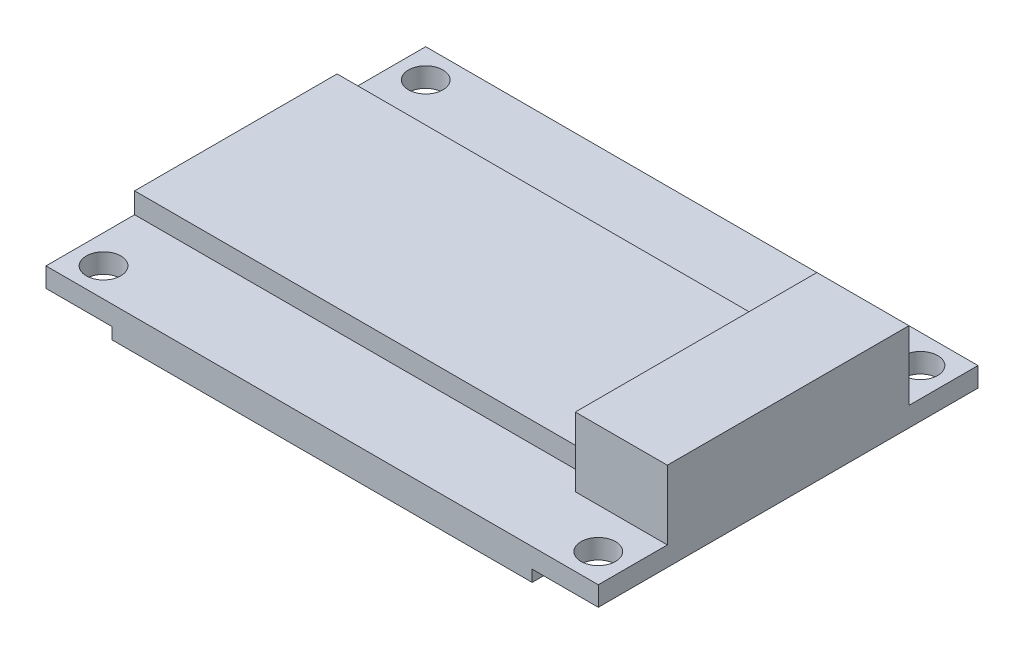
ISO-10303-21;
HEADER;
FILE_DESCRIPTION(('STEP AP214'),'2;1');
FILE_NAME('part.step','',(''),(''),'','','');
FILE_SCHEMA(('AUTOMOTIVE_DESIGN { 1 0 10303 214 1 1 1 1 }'));
ENDSEC;
DATA;
#1=APPLICATION_CONTEXT('core data for automotive mechanical design processes');
#2=APPLICATION_PROTOCOL_DEFINITION('international standard','automotive_design',2000,#1);
#3=PRODUCT_CONTEXT('',#1,'mechanical');
#4=PRODUCT('Part','Part','',(#3));
#5=PRODUCT_RELATED_PRODUCT_CATEGORY('part','',(#4));
#6=PRODUCT_DEFINITION_FORMATION('','',#4);
#7=PRODUCT_DEFINITION_CONTEXT('part definition',#1,'design');
#8=PRODUCT_DEFINITION('design','',#6,#7);
#9=PRODUCT_DEFINITION_SHAPE('','',#8);
#10=(LENGTH_UNIT() NAMED_UNIT(*) SI_UNIT(.MILLI.,.METRE.));
#11=(NAMED_UNIT(*) PLANE_ANGLE_UNIT() SI_UNIT($,.RADIAN.));
#12=(NAMED_UNIT(*) SI_UNIT($,.STERADIAN.) SOLID_ANGLE_UNIT());
#13=UNCERTAINTY_MEASURE_WITH_UNIT(LENGTH_MEASURE(1.E-05),#10,'distance_accuracy_value','');
#14=(GEOMETRIC_REPRESENTATION_CONTEXT(3) GLOBAL_UNCERTAINTY_ASSIGNED_CONTEXT((#13)) GLOBAL_UNIT_ASSIGNED_CONTEXT((#10,
#11,#12)) REPRESENTATION_CONTEXT('',''));
#15=CARTESIAN_POINT('',(0.,0.,0.));
#16=DIRECTION('',(0.,0.,1.));
#17=DIRECTION('',(1.,0.,0.));
#18=AXIS2_PLACEMENT_3D('',#15,#16,#17);
#19=CARTESIAN_POINT('',(0.,1.7,0.));
#20=DIRECTION('',(0.,-1.,0.));
#21=DIRECTION('',(0.,0.,-1.));
#22=AXIS2_PLACEMENT_3D('',#19,#20,#21);
#23=PLANE('',#22);
#24=CARTESIAN_POINT('',(2.5,1.7,-2.5));
#25=DIRECTION('',(0.,1.,0.));
#26=DIRECTION('',(0.,0.,1.));
#27=AXIS2_PLACEMENT_3D('',#24,#25,#26);
#28=CIRCLE('',#27,1.5);
#29=CARTESIAN_POINT('',(2.5,1.7,-0.999999999999999));
#30=VERTEX_POINT('',#29);
#31=EDGE_CURVE('E220',#30,#30,#28,.T.);
#32=ORIENTED_EDGE('',*,*,#31,.F.);
#33=EDGE_LOOP('',(#32));
#34=FACE_BOUND('',#33,.T.);
#35=CARTESIAN_POINT('',(45.5,1.7,-2.5));
#36=DIRECTION('',(0.,1.,0.));
#37=DIRECTION('',(0.,0.,-1.));
#38=AXIS2_PLACEMENT_3D('',#35,#36,#37);
#39=CIRCLE('',#38,1.5);
#40=CARTESIAN_POINT('',(45.5,1.7,-4.));
#41=VERTEX_POINT('',#40);
#42=EDGE_CURVE('E221',#41,#41,#39,.T.);
#43=ORIENTED_EDGE('',*,*,#42,.F.);
#44=EDGE_LOOP('',(#43));
#45=FACE_BOUND('',#44,.T.);
#46=DIRECTION('',(1.,0.,0.));
#47=VECTOR('',#46,1.);
#48=CARTESIAN_POINT('',(40.,1.7,-7.7));
#49=LINE('',#48,#47);
#50=CARTESIAN_POINT('',(0.,1.7,-7.7));
#51=VERTEX_POINT('',#50);
#52=CARTESIAN_POINT('',(40.,1.7,-7.7));
#53=VERTEX_POINT('',#52);
#54=EDGE_CURVE('E358',#51,#53,#49,.T.);
#55=ORIENTED_EDGE('',*,*,#54,.F.);
#56=DIRECTION('',(0.,0.,1.));
#57=VECTOR('',#56,1.);
#58=CARTESIAN_POINT('',(0.,1.7,0.));
#59=LINE('',#58,#57);
#60=CARTESIAN_POINT('',(0.,1.7,0.));
#61=VERTEX_POINT('',#60);
#62=EDGE_CURVE('E180',#51,#61,#59,.T.);
#63=ORIENTED_EDGE('',*,*,#62,.T.);
#64=DIRECTION('',(1.,0.,0.));
#65=VECTOR('',#64,1.);
#66=CARTESIAN_POINT('',(0.,1.7,0.));
#67=LINE('',#66,#65);
#68=CARTESIAN_POINT('',(48.,1.7,0.));
#69=VERTEX_POINT('',#68);
#70=EDGE_CURVE('E278',#61,#69,#67,.T.);
#71=ORIENTED_EDGE('',*,*,#70,.T.);
#72=DIRECTION('',(0.,0.,-1.));
#73=VECTOR('',#72,1.);
#74=CARTESIAN_POINT('',(48.,1.7,0.));
#75=LINE('',#74,#73);
#76=CARTESIAN_POINT('',(48.,1.7,-6.));
#77=VERTEX_POINT('',#76);
#78=EDGE_CURVE('E281',#69,#77,#75,.T.);
#79=ORIENTED_EDGE('',*,*,#78,.T.);
#80=DIRECTION('',(1.,0.,0.));
#81=VECTOR('',#80,1.);
#82=CARTESIAN_POINT('',(40.,1.7,-6.));
#83=LINE('',#82,#81);
#84=CARTESIAN_POINT('',(40.,1.7,-6.));
#85=VERTEX_POINT('',#84);
#86=EDGE_CURVE('E257',#85,#77,#83,.T.);
#87=ORIENTED_EDGE('',*,*,#86,.F.);
#88=DIRECTION('',(0.,0.,1.));
#89=VECTOR('',#88,1.);
#90=CARTESIAN_POINT('',(40.,1.7,-27.));
#91=LINE('',#90,#89);
#92=EDGE_CURVE('E240',#53,#85,#91,.T.);
#93=ORIENTED_EDGE('',*,*,#92,.F.);
#94=EDGE_LOOP('',(#55,#63,#71,#79,#87,#93));
#95=FACE_BOUND('',#94,.T.);
#96=ADVANCED_FACE('F40',(#34,#45,#95),#23,.F.);
#97=CARTESIAN_POINT('',(45.5,1.7,-30.5));
#98=DIRECTION('',(0.,1.,0.));
#99=DIRECTION('',(0.,0.,1.));
#100=AXIS2_PLACEMENT_3D('',#97,#98,#99);
#101=CIRCLE('',#100,1.5);
#102=CARTESIAN_POINT('',(45.5,1.7,-29.));
#103=VERTEX_POINT('',#102);
#104=EDGE_CURVE('E227',#103,#103,#101,.T.);
#105=ORIENTED_EDGE('',*,*,#104,.F.);
#106=EDGE_LOOP('',(#105));
#107=FACE_BOUND('',#106,.T.);
#108=CARTESIAN_POINT('',(2.5,1.7,-30.5));
#109=DIRECTION('',(0.,1.,0.));
#110=DIRECTION('',(0.,0.,-1.));
#111=AXIS2_PLACEMENT_3D('',#108,#109,#110);
#112=CIRCLE('',#111,1.5);
#113=CARTESIAN_POINT('',(2.5,1.7,-32.));
#114=VERTEX_POINT('',#113);
#115=EDGE_CURVE('E216',#114,#114,#112,.T.);
#116=ORIENTED_EDGE('',*,*,#115,.F.);
#117=EDGE_LOOP('',(#116));
#118=FACE_BOUND('',#117,.T.);
#119=DIRECTION('',(-1.,0.,0.));
#120=VECTOR('',#119,1.);
#121=CARTESIAN_POINT('',(40.,1.7,-25.3));
#122=LINE('',#121,#120);
#123=CARTESIAN_POINT('',(40.,1.7,-25.3));
#124=VERTEX_POINT('',#123);
#125=CARTESIAN_POINT('',(0.,1.7,-25.3));
#126=VERTEX_POINT('',#125);
#127=EDGE_CURVE('E175',#124,#126,#122,.T.);
#128=ORIENTED_EDGE('',*,*,#127,.F.);
#129=CARTESIAN_POINT('',(40.,1.7,-27.));
#130=VERTEX_POINT('',#129);
#131=EDGE_CURVE('E254',#130,#124,#91,.T.);
#132=ORIENTED_EDGE('',*,*,#131,.F.);
#133=DIRECTION('',(-1.,0.,0.));
#134=VECTOR('',#133,1.);
#135=CARTESIAN_POINT('',(40.,1.7,-27.));
#136=LINE('',#135,#134);
#137=CARTESIAN_POINT('',(48.,1.7,-27.));
#138=VERTEX_POINT('',#137);
#139=EDGE_CURVE('E247',#138,#130,#136,.T.);
#140=ORIENTED_EDGE('',*,*,#139,.F.);
#141=CARTESIAN_POINT('',(48.,1.7,-33.));
#142=VERTEX_POINT('',#141);
#143=EDGE_CURVE('E280',#138,#142,#75,.T.);
#144=ORIENTED_EDGE('',*,*,#143,.T.);
#145=DIRECTION('',(-1.,0.,0.));
#146=VECTOR('',#145,1.);
#147=CARTESIAN_POINT('',(0.,1.7,-33.));
#148=LINE('',#147,#146);
#149=CARTESIAN_POINT('',(0.,1.7,-33.));
#150=VERTEX_POINT('',#149);
#151=EDGE_CURVE('E283',#142,#150,#148,.T.);
#152=ORIENTED_EDGE('',*,*,#151,.T.);
#153=EDGE_CURVE('E274',#150,#126,#59,.T.);
#154=ORIENTED_EDGE('',*,*,#153,.T.);
#155=EDGE_LOOP('',(#128,#132,#140,#144,#152,#154));
#156=FACE_BOUND('',#155,.T.);
#157=ADVANCED_FACE('F340',(#107,#118,#156),#23,.F.);
#158=CARTESIAN_POINT('',(40.,7.7,-27.));
#159=DIRECTION('',(1.,0.,0.));
#160=DIRECTION('',(0.,0.,-1.));
#161=AXIS2_PLACEMENT_3D('',#158,#159,#160);
#162=PLANE('',#161);
#163=DIRECTION('',(0.,-1.,0.));
#164=VECTOR('',#163,1.);
#165=CARTESIAN_POINT('',(40.,3.5,-7.7));
#166=LINE('',#165,#164);
#167=CARTESIAN_POINT('',(40.,3.5,-7.70000000000001));
#168=VERTEX_POINT('',#167);
#169=EDGE_CURVE('E55',#168,#53,#166,.T.);
#170=ORIENTED_EDGE('',*,*,#169,.T.);
#171=ORIENTED_EDGE('',*,*,#92,.T.);
#172=DIRECTION('',(0.,-1.,0.));
#173=VECTOR('',#172,1.);
#174=CARTESIAN_POINT('',(40.,7.7,-6.));
#175=LINE('',#174,#173);
#176=CARTESIAN_POINT('',(40.,7.7,-6.));
#177=VERTEX_POINT('',#176);
#178=EDGE_CURVE('E270',#177,#85,#175,.T.);
#179=ORIENTED_EDGE('',*,*,#178,.F.);
#180=DIRECTION('',(0.,0.,1.));
#181=VECTOR('',#180,1.);
#182=CARTESIAN_POINT('',(40.,7.7,-27.));
#183=LINE('',#182,#181);
#184=CARTESIAN_POINT('',(40.,7.7,-27.));
#185=VERTEX_POINT('',#184);
#186=EDGE_CURVE('E243',#185,#177,#183,.T.);
#187=ORIENTED_EDGE('',*,*,#186,.F.);
#188=DIRECTION('',(0.,-1.,0.));
#189=VECTOR('',#188,1.);
#190=CARTESIAN_POINT('',(40.,7.7,-27.));
#191=LINE('',#190,#189);
#192=EDGE_CURVE('E253',#185,#130,#191,.T.);
#193=ORIENTED_EDGE('',*,*,#192,.T.);
#194=ORIENTED_EDGE('',*,*,#131,.T.);
#195=DIRECTION('',(0.,-1.,0.));
#196=VECTOR('',#195,1.);
#197=CARTESIAN_POINT('',(40.,3.5,-25.3));
#198=LINE('',#197,#196);
#199=CARTESIAN_POINT('',(40.,3.5,-25.3));
#200=VERTEX_POINT('',#199);
#201=EDGE_CURVE('E186',#200,#124,#198,.T.);
#202=ORIENTED_EDGE('',*,*,#201,.F.);
#203=DIRECTION('',(0.,0.,-1.));
#204=VECTOR('',#203,1.);
#205=CARTESIAN_POINT('',(40.,3.5,-7.7));
#206=LINE('',#205,#204);
#207=EDGE_CURVE('E164',#168,#200,#206,.T.);
#208=ORIENTED_EDGE('',*,*,#207,.F.);
#209=EDGE_LOOP('',(#170,#171,#179,#187,#193,#194,#202,#208));
#210=FACE_BOUND('',#209,.T.);
#211=ADVANCED_FACE('F371',(#210),#162,.F.);
#212=CARTESIAN_POINT('',(0.,0.,0.));
#213=DIRECTION('',(0.,-1.,0.));
#214=DIRECTION('',(0.,0.,-1.));
#215=AXIS2_PLACEMENT_3D('',#212,#213,#214);
#216=PLANE('',#215);
#217=DIRECTION('',(0.,0.,1.));
#218=VECTOR('',#217,1.);
#219=CARTESIAN_POINT('',(42.25,0.,-33.));
#220=LINE('',#219,#218);
#221=CARTESIAN_POINT('',(42.25,0.,-33.));
#222=VERTEX_POINT('',#221);
#223=CARTESIAN_POINT('',(42.25,0.,0.));
#224=VERTEX_POINT('',#223);
#225=EDGE_CURVE('E181',#222,#224,#220,.T.);
#226=ORIENTED_EDGE('',*,*,#225,.F.);
#227=DIRECTION('',(-1.,0.,0.));
#228=VECTOR('',#227,1.);
#229=CARTESIAN_POINT('',(0.,0.,-33.));
#230=LINE('',#229,#228);
#231=CARTESIAN_POINT('',(48.,0.,-33.));
#232=VERTEX_POINT('',#231);
#233=EDGE_CURVE('E296',#232,#222,#230,.T.);
#234=ORIENTED_EDGE('',*,*,#233,.F.);
#235=DIRECTION('',(0.,0.,-1.));
#236=VECTOR('',#235,1.);
#237=CARTESIAN_POINT('',(48.,0.,0.));
#238=LINE('',#237,#236);
#239=CARTESIAN_POINT('',(48.,0.,0.));
#240=VERTEX_POINT('',#239);
#241=EDGE_CURVE('E292',#240,#232,#238,.T.);
#242=ORIENTED_EDGE('',*,*,#241,.F.);
#243=DIRECTION('',(1.,0.,0.));
#244=VECTOR('',#243,1.);
#245=CARTESIAN_POINT('',(0.,0.,0.));
#246=LINE('',#245,#244);
#247=EDGE_CURVE('E63',#224,#240,#246,.T.);
#248=ORIENTED_EDGE('',*,*,#247,.F.);
#249=EDGE_LOOP('',(#226,#234,#242,#248));
#250=FACE_BOUND('',#249,.T.);
#251=CARTESIAN_POINT('',(45.5,0.,-2.5));
#252=DIRECTION('',(0.,1.,0.));
#253=DIRECTION('',(0.,0.,-1.));
#254=AXIS2_PLACEMENT_3D('',#251,#252,#253);
#255=CIRCLE('',#254,1.5);
#256=CARTESIAN_POINT('',(45.5,0.,-4.));
#257=VERTEX_POINT('',#256);
#258=EDGE_CURVE('E217',#257,#257,#255,.T.);
#259=ORIENTED_EDGE('',*,*,#258,.T.);
#260=EDGE_LOOP('',(#259));
#261=FACE_BOUND('',#260,.T.);
#262=CARTESIAN_POINT('',(45.5,0.,-30.5));
#263=DIRECTION('',(0.,1.,0.));
#264=DIRECTION('',(0.,0.,1.));
#265=AXIS2_PLACEMENT_3D('',#262,#263,#264);
#266=CIRCLE('',#265,1.5);
#267=CARTESIAN_POINT('',(45.5,0.,-29.));
#268=VERTEX_POINT('',#267);
#269=EDGE_CURVE('E224',#268,#268,#266,.T.);
#270=ORIENTED_EDGE('',*,*,#269,.T.);
#271=EDGE_LOOP('',(#270));
#272=FACE_BOUND('',#271,.T.);
#273=ADVANCED_FACE('F313',(#250,#261,#272),#216,.T.);
#274=CARTESIAN_POINT('',(0.,1.7,0.));
#275=DIRECTION('',(1.,0.,0.));
#276=DIRECTION('',(0.,0.,-1.));
#277=AXIS2_PLACEMENT_3D('',#274,#275,#276);
#278=PLANE('',#277);
#279=DIRECTION('',(0.,0.,1.));
#280=VECTOR('',#279,1.);
#281=CARTESIAN_POINT('',(0.,0.,0.));
#282=LINE('',#281,#280);
#283=CARTESIAN_POINT('',(0.,0.,-33.));
#284=VERTEX_POINT('',#283);
#285=CARTESIAN_POINT('',(0.,0.,0.));
#286=VERTEX_POINT('',#285);
#287=EDGE_CURVE('E273',#284,#286,#282,.T.);
#288=ORIENTED_EDGE('',*,*,#287,.T.);
#289=DIRECTION('',(0.,-1.,0.));
#290=VECTOR('',#289,1.);
#291=CARTESIAN_POINT('',(0.,1.7,0.));
#292=LINE('',#291,#290);
#293=EDGE_CURVE('E11',#61,#286,#292,.T.);
#294=ORIENTED_EDGE('',*,*,#293,.F.);
#295=ORIENTED_EDGE('',*,*,#62,.F.);
#296=DIRECTION('',(0.,-1.,0.));
#297=VECTOR('',#296,1.);
#298=CARTESIAN_POINT('',(0.,3.5,-7.7));
#299=LINE('',#298,#297);
#300=CARTESIAN_POINT('',(0.,3.5,-7.7));
#301=VERTEX_POINT('',#300);
#302=EDGE_CURVE('E160',#301,#51,#299,.T.);
#303=ORIENTED_EDGE('',*,*,#302,.F.);
#304=DIRECTION('',(0.,0.,1.));
#305=VECTOR('',#304,1.);
#306=CARTESIAN_POINT('',(0.,3.5,-7.7));
#307=LINE('',#306,#305);
#308=CARTESIAN_POINT('',(0.,3.5,-25.3));
#309=VERTEX_POINT('',#308);
#310=EDGE_CURVE('E165',#309,#301,#307,.T.);
#311=ORIENTED_EDGE('',*,*,#310,.F.);
#312=DIRECTION('',(0.,-1.,0.));
#313=VECTOR('',#312,1.);
#314=CARTESIAN_POINT('',(0.,3.5,-25.3));
#315=LINE('',#314,#313);
#316=EDGE_CURVE('E365',#309,#126,#315,.T.);
#317=ORIENTED_EDGE('',*,*,#316,.T.);
#318=ORIENTED_EDGE('',*,*,#153,.F.);
#319=DIRECTION('',(0.,-1.,0.));
#320=VECTOR('',#319,1.);
#321=CARTESIAN_POINT('',(0.,1.7,-33.));
#322=LINE('',#321,#320);
#323=EDGE_CURVE('E286',#150,#284,#322,.T.);
#324=ORIENTED_EDGE('',*,*,#323,.T.);
#325=EDGE_LOOP('',(#288,#294,#295,#303,#311,#317,#318,#324));
#326=FACE_BOUND('',#325,.T.);
#327=ADVANCED_FACE('F42',(#326),#278,.F.);
#328=CARTESIAN_POINT('',(0.,1.7,0.));
#329=DIRECTION('',(0.,0.,-1.));
#330=DIRECTION('',(-1.,0.,0.));
#331=AXIS2_PLACEMENT_3D('',#328,#329,#330);
#332=PLANE('',#331);
#333=CARTESIAN_POINT('',(5.75,0.,0.));
#334=VERTEX_POINT('',#333);
#335=EDGE_CURVE('E289',#286,#334,#246,.T.);
#336=ORIENTED_EDGE('',*,*,#335,.T.);
#337=DIRECTION('',(0.,1.,0.));
#338=VECTOR('',#337,1.);
#339=CARTESIAN_POINT('',(5.75,-1.,0.));
#340=LINE('',#339,#338);
#341=CARTESIAN_POINT('',(5.75,-1.,0.));
#342=VERTEX_POINT('',#341);
#343=EDGE_CURVE('E211',#342,#334,#340,.T.);
#344=ORIENTED_EDGE('',*,*,#343,.F.);
#345=DIRECTION('',(-1.,0.,0.));
#346=VECTOR('',#345,1.);
#347=CARTESIAN_POINT('',(5.75,-1.,0.));
#348=LINE('',#347,#346);
#349=CARTESIAN_POINT('',(42.25,-1.,0.));
#350=VERTEX_POINT('',#349);
#351=EDGE_CURVE('E193',#350,#342,#348,.T.);
#352=ORIENTED_EDGE('',*,*,#351,.F.);
#353=DIRECTION('',(0.,1.,0.));
#354=VECTOR('',#353,1.);
#355=CARTESIAN_POINT('',(42.25,-1.,0.));
#356=LINE('',#355,#354);
#357=EDGE_CURVE('E214',#350,#224,#356,.T.);
#358=ORIENTED_EDGE('',*,*,#357,.T.);
#359=ORIENTED_EDGE('',*,*,#247,.T.);
#360=DIRECTION('',(0.,-1.,0.));
#361=VECTOR('',#360,1.);
#362=CARTESIAN_POINT('',(48.,1.7,0.));
#363=LINE('',#362,#361);
#364=EDGE_CURVE('E48',#69,#240,#363,.T.);
#365=ORIENTED_EDGE('',*,*,#364,.F.);
#366=ORIENTED_EDGE('',*,*,#70,.F.);
#367=ORIENTED_EDGE('',*,*,#293,.T.);
#368=EDGE_LOOP('',(#336,#344,#352,#358,#359,#365,#366,#367));
#369=FACE_BOUND('',#368,.T.);
#370=ADVANCED_FACE('F336',(#369),#332,.F.);
#371=CARTESIAN_POINT('',(48.,1.7,0.));
#372=DIRECTION('',(-1.,0.,0.));
#373=DIRECTION('',(0.,0.,1.));
#374=AXIS2_PLACEMENT_3D('',#371,#372,#373);
#375=PLANE('',#374);
#376=ORIENTED_EDGE('',*,*,#241,.T.);
#377=DIRECTION('',(0.,-1.,0.));
#378=VECTOR('',#377,1.);
#379=CARTESIAN_POINT('',(48.,1.7,-33.));
#380=LINE('',#379,#378);
#381=EDGE_CURVE('E302',#142,#232,#380,.T.);
#382=ORIENTED_EDGE('',*,*,#381,.F.);
#383=ORIENTED_EDGE('',*,*,#143,.F.);
#384=DIRECTION('',(0.,-1.,0.));
#385=VECTOR('',#384,1.);
#386=CARTESIAN_POINT('',(48.,7.7,-27.));
#387=LINE('',#386,#385);
#388=CARTESIAN_POINT('',(48.,7.7,-27.));
#389=VERTEX_POINT('',#388);
#390=EDGE_CURVE('E264',#389,#138,#387,.T.);
#391=ORIENTED_EDGE('',*,*,#390,.F.);
#392=DIRECTION('',(0.,0.,-1.));
#393=VECTOR('',#392,1.);
#394=CARTESIAN_POINT('',(48.,7.7,-27.));
#395=LINE('',#394,#393);
#396=CARTESIAN_POINT('',(48.,7.7,-6.));
#397=VERTEX_POINT('',#396);
#398=EDGE_CURVE('E249',#397,#389,#395,.T.);
#399=ORIENTED_EDGE('',*,*,#398,.F.);
#400=DIRECTION('',(0.,-1.,0.));
#401=VECTOR('',#400,1.);
#402=CARTESIAN_POINT('',(48.,7.7,-6.));
#403=LINE('',#402,#401);
#404=EDGE_CURVE('E267',#397,#77,#403,.T.);
#405=ORIENTED_EDGE('',*,*,#404,.T.);
#406=ORIENTED_EDGE('',*,*,#78,.F.);
#407=ORIENTED_EDGE('',*,*,#364,.T.);
#408=EDGE_LOOP('',(#376,#382,#383,#391,#399,#405,#406,#407));
#409=FACE_BOUND('',#408,.T.);
#410=ADVANCED_FACE('F308',(#409),#375,.F.);
#411=CARTESIAN_POINT('',(0.,1.7,-33.));
#412=DIRECTION('',(0.,0.,1.));
#413=DIRECTION('',(1.,0.,0.));
#414=AXIS2_PLACEMENT_3D('',#411,#412,#413);
#415=PLANE('',#414);
#416=ORIENTED_EDGE('',*,*,#233,.T.);
#417=DIRECTION('',(0.,1.,0.));
#418=VECTOR('',#417,1.);
#419=CARTESIAN_POINT('',(42.25,-1.,-33.));
#420=LINE('',#419,#418);
#421=CARTESIAN_POINT('',(42.25,-1.,-33.));
#422=VERTEX_POINT('',#421);
#423=EDGE_CURVE('E200',#422,#222,#420,.T.);
#424=ORIENTED_EDGE('',*,*,#423,.F.);
#425=DIRECTION('',(1.,0.,0.));
#426=VECTOR('',#425,1.);
#427=CARTESIAN_POINT('',(5.75,-1.,-33.));
#428=LINE('',#427,#426);
#429=CARTESIAN_POINT('',(5.75,-1.,-33.));
#430=VERTEX_POINT('',#429);
#431=EDGE_CURVE('E198',#430,#422,#428,.T.);
#432=ORIENTED_EDGE('',*,*,#431,.F.);
#433=DIRECTION('',(0.,1.,0.));
#434=VECTOR('',#433,1.);
#435=CARTESIAN_POINT('',(5.75,-1.,-33.));
#436=LINE('',#435,#434);
#437=CARTESIAN_POINT('',(5.75,0.,-33.));
#438=VERTEX_POINT('',#437);
#439=EDGE_CURVE('E207',#430,#438,#436,.T.);
#440=ORIENTED_EDGE('',*,*,#439,.T.);
#441=EDGE_CURVE('E295',#438,#284,#230,.T.);
#442=ORIENTED_EDGE('',*,*,#441,.T.);
#443=ORIENTED_EDGE('',*,*,#323,.F.);
#444=ORIENTED_EDGE('',*,*,#151,.F.);
#445=ORIENTED_EDGE('',*,*,#381,.T.);
#446=EDGE_LOOP('',(#416,#424,#432,#440,#442,#443,#444,#445));
#447=FACE_BOUND('',#446,.T.);
#448=ADVANCED_FACE('F317',(#447),#415,.F.);
#449=DIRECTION('',(0.,0.,-1.));
#450=VECTOR('',#449,1.);
#451=CARTESIAN_POINT('',(5.75,0.,-33.));
#452=LINE('',#451,#450);
#453=EDGE_CURVE('E184',#334,#438,#452,.T.);
#454=ORIENTED_EDGE('',*,*,#453,.F.);
#455=ORIENTED_EDGE('',*,*,#335,.F.);
#456=ORIENTED_EDGE('',*,*,#287,.F.);
#457=ORIENTED_EDGE('',*,*,#441,.F.);
#458=EDGE_LOOP('',(#454,#455,#456,#457));
#459=FACE_BOUND('',#458,.T.);
#460=CARTESIAN_POINT('',(2.5,0.,-30.5));
#461=DIRECTION('',(0.,1.,0.));
#462=DIRECTION('',(0.,0.,-1.));
#463=AXIS2_PLACEMENT_3D('',#460,#461,#462);
#464=CIRCLE('',#463,1.5);
#465=CARTESIAN_POINT('',(2.5,0.,-32.));
#466=VERTEX_POINT('',#465);
#467=EDGE_CURVE('E230',#466,#466,#464,.T.);
#468=ORIENTED_EDGE('',*,*,#467,.T.);
#469=EDGE_LOOP('',(#468));
#470=FACE_BOUND('',#469,.T.);
#471=CARTESIAN_POINT('',(2.5,0.,-2.5));
#472=DIRECTION('',(0.,1.,0.));
#473=DIRECTION('',(0.,0.,1.));
#474=AXIS2_PLACEMENT_3D('',#471,#472,#473);
#475=CIRCLE('',#474,1.5);
#476=CARTESIAN_POINT('',(2.5,0.,-0.999999999999999));
#477=VERTEX_POINT('',#476);
#478=EDGE_CURVE('E237',#477,#477,#475,.T.);
#479=ORIENTED_EDGE('',*,*,#478,.T.);
#480=EDGE_LOOP('',(#479));
#481=FACE_BOUND('',#480,.T.);
#482=ADVANCED_FACE('F333',(#459,#470,#481),#216,.T.);
#483=CARTESIAN_POINT('',(40.,7.7,-6.));
#484=DIRECTION('',(0.,0.,-1.));
#485=DIRECTION('',(-1.,0.,0.));
#486=AXIS2_PLACEMENT_3D('',#483,#484,#485);
#487=PLANE('',#486);
#488=ORIENTED_EDGE('',*,*,#86,.T.);
#489=ORIENTED_EDGE('',*,*,#404,.F.);
#490=DIRECTION('',(1.,0.,0.));
#491=VECTOR('',#490,1.);
#492=CARTESIAN_POINT('',(40.,7.7,-6.));
#493=LINE('',#492,#491);
#494=EDGE_CURVE('E246',#177,#397,#493,.T.);
#495=ORIENTED_EDGE('',*,*,#494,.F.);
#496=ORIENTED_EDGE('',*,*,#178,.T.);
#497=EDGE_LOOP('',(#488,#489,#495,#496));
#498=FACE_BOUND('',#497,.T.);
#499=ADVANCED_FACE('F354',(#498),#487,.F.);
#500=CARTESIAN_POINT('',(40.,7.7,-27.));
#501=DIRECTION('',(0.,0.,1.));
#502=DIRECTION('',(1.,0.,0.));
#503=AXIS2_PLACEMENT_3D('',#500,#501,#502);
#504=PLANE('',#503);
#505=ORIENTED_EDGE('',*,*,#139,.T.);
#506=ORIENTED_EDGE('',*,*,#192,.F.);
#507=DIRECTION('',(-1.,0.,0.));
#508=VECTOR('',#507,1.);
#509=CARTESIAN_POINT('',(40.,7.7,-27.));
#510=LINE('',#509,#508);
#511=EDGE_CURVE('E251',#389,#185,#510,.T.);
#512=ORIENTED_EDGE('',*,*,#511,.F.);
#513=ORIENTED_EDGE('',*,*,#390,.T.);
#514=EDGE_LOOP('',(#505,#506,#512,#513));
#515=FACE_BOUND('',#514,.T.);
#516=ADVANCED_FACE('F346',(#515),#504,.F.);
#517=CARTESIAN_POINT('',(0.,7.7,0.));
#518=DIRECTION('',(0.,1.,0.));
#519=DIRECTION('',(0.,0.,1.));
#520=AXIS2_PLACEMENT_3D('',#517,#518,#519);
#521=PLANE('',#520);
#522=ORIENTED_EDGE('',*,*,#186,.T.);
#523=ORIENTED_EDGE('',*,*,#494,.T.);
#524=ORIENTED_EDGE('',*,*,#398,.T.);
#525=ORIENTED_EDGE('',*,*,#511,.T.);
#526=EDGE_LOOP('',(#522,#523,#524,#525));
#527=FACE_BOUND('',#526,.T.);
#528=ADVANCED_FACE('F350',(#527),#521,.T.);
#529=CARTESIAN_POINT('',(2.5,0.,-2.5));
#530=DIRECTION('',(0.,1.,0.));
#531=DIRECTION('',(0.,0.,1.));
#532=AXIS2_PLACEMENT_3D('',#529,#530,#531);
#533=CYLINDRICAL_SURFACE('',#532,1.5);
#534=ORIENTED_EDGE('',*,*,#478,.F.);
#535=EDGE_LOOP('',(#534));
#536=FACE_BOUND('',#535,.T.);
#537=ORIENTED_EDGE('',*,*,#31,.T.);
#538=EDGE_LOOP('',(#537));
#539=FACE_BOUND('',#538,.T.);
#540=ADVANCED_FACE('F509',(#536,#539),#533,.F.);
#541=CARTESIAN_POINT('',(45.5,0.,-2.5));
#542=DIRECTION('',(0.,1.,0.));
#543=DIRECTION('',(0.,0.,1.));
#544=AXIS2_PLACEMENT_3D('',#541,#542,#543);
#545=CYLINDRICAL_SURFACE('',#544,1.5);
#546=ORIENTED_EDGE('',*,*,#258,.F.);
#547=EDGE_LOOP('',(#546));
#548=FACE_BOUND('',#547,.T.);
#549=ORIENTED_EDGE('',*,*,#42,.T.);
#550=EDGE_LOOP('',(#549));
#551=FACE_BOUND('',#550,.T.);
#552=ADVANCED_FACE('F505',(#548,#551),#545,.F.);
#553=CARTESIAN_POINT('',(45.5,0.,-30.5));
#554=DIRECTION('',(0.,1.,0.));
#555=DIRECTION('',(0.,0.,1.));
#556=AXIS2_PLACEMENT_3D('',#553,#554,#555);
#557=CYLINDRICAL_SURFACE('',#556,1.5);
#558=ORIENTED_EDGE('',*,*,#269,.F.);
#559=EDGE_LOOP('',(#558));
#560=FACE_BOUND('',#559,.T.);
#561=ORIENTED_EDGE('',*,*,#104,.T.);
#562=EDGE_LOOP('',(#561));
#563=FACE_BOUND('',#562,.T.);
#564=ADVANCED_FACE('F508',(#560,#563),#557,.F.);
#565=CARTESIAN_POINT('',(2.5,0.,-30.5));
#566=DIRECTION('',(0.,1.,0.));
#567=DIRECTION('',(0.,0.,1.));
#568=AXIS2_PLACEMENT_3D('',#565,#566,#567);
#569=CYLINDRICAL_SURFACE('',#568,1.5);
#570=ORIENTED_EDGE('',*,*,#467,.F.);
#571=EDGE_LOOP('',(#570));
#572=FACE_BOUND('',#571,.T.);
#573=ORIENTED_EDGE('',*,*,#115,.T.);
#574=EDGE_LOOP('',(#573));
#575=FACE_BOUND('',#574,.T.);
#576=ADVANCED_FACE('F413',(#572,#575),#569,.F.);
#577=CARTESIAN_POINT('',(42.25,-1.,-33.));
#578=DIRECTION('',(-1.,0.,0.));
#579=DIRECTION('',(0.,0.,1.));
#580=AXIS2_PLACEMENT_3D('',#577,#578,#579);
#581=PLANE('',#580);
#582=ORIENTED_EDGE('',*,*,#225,.T.);
#583=ORIENTED_EDGE('',*,*,#357,.F.);
#584=DIRECTION('',(0.,0.,1.));
#585=VECTOR('',#584,1.);
#586=CARTESIAN_POINT('',(42.25,-1.,-33.));
#587=LINE('',#586,#585);
#588=EDGE_CURVE('E190',#422,#350,#587,.T.);
#589=ORIENTED_EDGE('',*,*,#588,.F.);
#590=ORIENTED_EDGE('',*,*,#423,.T.);
#591=EDGE_LOOP('',(#582,#583,#589,#590));
#592=FACE_BOUND('',#591,.T.);
#593=ADVANCED_FACE('F322',(#592),#581,.F.);
#594=CARTESIAN_POINT('',(5.75,-1.,-33.));
#595=DIRECTION('',(1.,0.,0.));
#596=DIRECTION('',(0.,0.,-1.));
#597=AXIS2_PLACEMENT_3D('',#594,#595,#596);
#598=PLANE('',#597);
#599=ORIENTED_EDGE('',*,*,#453,.T.);
#600=ORIENTED_EDGE('',*,*,#439,.F.);
#601=DIRECTION('',(0.,0.,-1.));
#602=VECTOR('',#601,1.);
#603=CARTESIAN_POINT('',(5.75,-1.,-33.));
#604=LINE('',#603,#602);
#605=EDGE_CURVE('E195',#342,#430,#604,.T.);
#606=ORIENTED_EDGE('',*,*,#605,.F.);
#607=ORIENTED_EDGE('',*,*,#343,.T.);
#608=EDGE_LOOP('',(#599,#600,#606,#607));
#609=FACE_BOUND('',#608,.T.);
#610=ADVANCED_FACE('F331',(#609),#598,.F.);
#611=CARTESIAN_POINT('',(0.,-1.,0.));
#612=DIRECTION('',(0.,1.,0.));
#613=DIRECTION('',(0.,0.,1.));
#614=AXIS2_PLACEMENT_3D('',#611,#612,#613);
#615=PLANE('',#614);
#616=ORIENTED_EDGE('',*,*,#588,.T.);
#617=ORIENTED_EDGE('',*,*,#351,.T.);
#618=ORIENTED_EDGE('',*,*,#605,.T.);
#619=ORIENTED_EDGE('',*,*,#431,.T.);
#620=EDGE_LOOP('',(#616,#617,#618,#619));
#621=FACE_BOUND('',#620,.T.);
#622=ADVANCED_FACE('F325',(#621),#615,.F.);
#623=CARTESIAN_POINT('',(40.,3.5,-7.7));
#624=DIRECTION('',(0.,0.,-1.));
#625=DIRECTION('',(-1.,0.,0.));
#626=AXIS2_PLACEMENT_3D('',#623,#624,#625);
#627=PLANE('',#626);
#628=ORIENTED_EDGE('',*,*,#54,.T.);
#629=ORIENTED_EDGE('',*,*,#169,.F.);
#630=DIRECTION('',(1.,0.,0.));
#631=VECTOR('',#630,1.);
#632=CARTESIAN_POINT('',(40.,3.5,-7.7));
#633=LINE('',#632,#631);
#634=EDGE_CURVE('E156',#301,#168,#633,.T.);
#635=ORIENTED_EDGE('',*,*,#634,.F.);
#636=ORIENTED_EDGE('',*,*,#302,.T.);
#637=EDGE_LOOP('',(#628,#629,#635,#636));
#638=FACE_BOUND('',#637,.T.);
#639=ADVANCED_FACE('F158',(#638),#627,.F.);
#640=CARTESIAN_POINT('',(40.,3.5,-25.3));
#641=DIRECTION('',(0.,0.,1.));
#642=DIRECTION('',(1.,0.,0.));
#643=AXIS2_PLACEMENT_3D('',#640,#641,#642);
#644=PLANE('',#643);
#645=ORIENTED_EDGE('',*,*,#127,.T.);
#646=ORIENTED_EDGE('',*,*,#316,.F.);
#647=DIRECTION('',(-1.,0.,0.));
#648=VECTOR('',#647,1.);
#649=CARTESIAN_POINT('',(40.,3.5,-25.3));
#650=LINE('',#649,#648);
#651=EDGE_CURVE('E170',#200,#309,#650,.T.);
#652=ORIENTED_EDGE('',*,*,#651,.F.);
#653=ORIENTED_EDGE('',*,*,#201,.T.);
#654=EDGE_LOOP('',(#645,#646,#652,#653));
#655=FACE_BOUND('',#654,.T.);
#656=ADVANCED_FACE('F369',(#655),#644,.F.);
#657=CARTESIAN_POINT('',(0.,3.5,0.));
#658=DIRECTION('',(0.,1.,0.));
#659=DIRECTION('',(0.,0.,1.));
#660=AXIS2_PLACEMENT_3D('',#657,#658,#659);
#661=PLANE('',#660);
#662=ORIENTED_EDGE('',*,*,#310,.T.);
#663=ORIENTED_EDGE('',*,*,#634,.T.);
#664=ORIENTED_EDGE('',*,*,#207,.T.);
#665=ORIENTED_EDGE('',*,*,#651,.T.);
#666=EDGE_LOOP('',(#662,#663,#664,#665));
#667=FACE_BOUND('',#666,.T.);
#668=ADVANCED_FACE('F168',(#667),#661,.T.);
#669=CLOSED_SHELL('',(#96,#157,#211,#273,#327,#370,#410,#448,#482,#499,#516,#528,#540,#552,#564,
#576,#593,#610,#622,#639,#656,#668));
#670=MANIFOLD_SOLID_BREP('B2',#669);
#671=ADVANCED_BREP_SHAPE_REPRESENTATION('',(#18,#670),#14);
#672=SHAPE_DEFINITION_REPRESENTATION(#9,#671);
ENDSEC;
END-ISO-10303-21;
